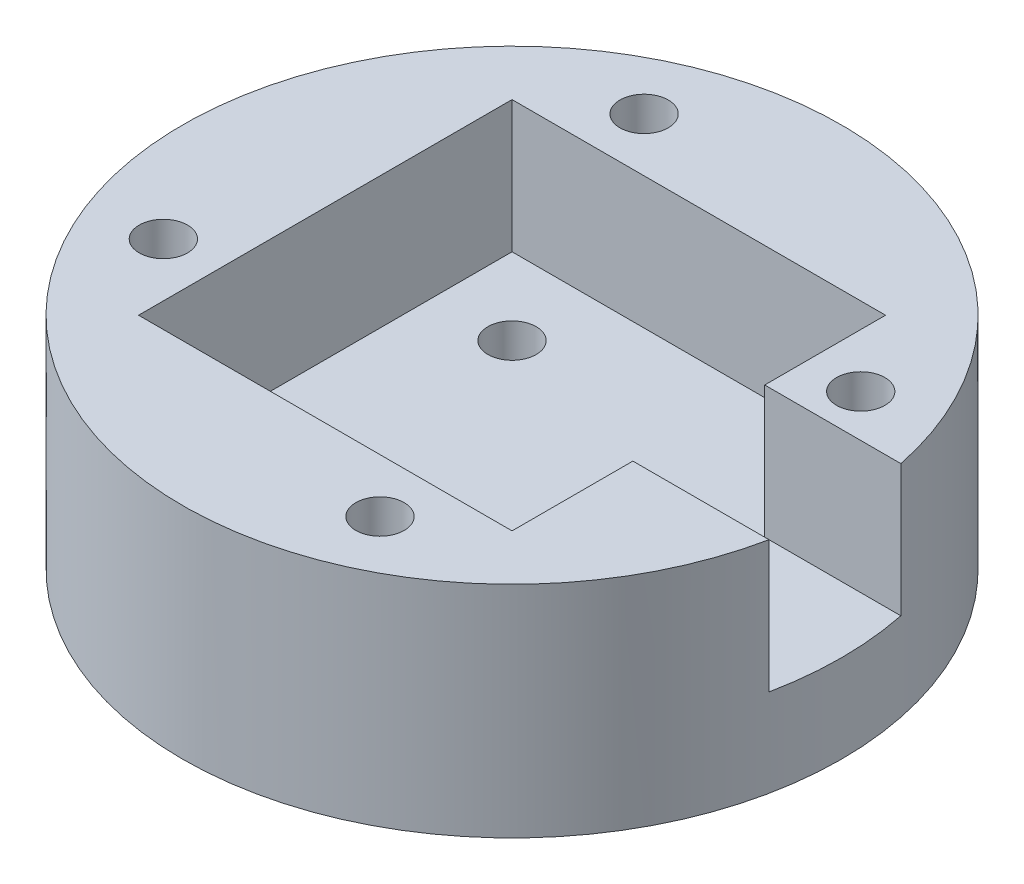
ISO-10303-21;
HEADER;
FILE_DESCRIPTION(('STEP AP214'),'2;1');
FILE_NAME('part.step','',(''),(''),'','','');
FILE_SCHEMA(('AUTOMOTIVE_DESIGN { 1 0 10303 214 1 1 1 1 }'));
ENDSEC;
DATA;
#1=APPLICATION_CONTEXT('core data for automotive mechanical design processes');
#2=APPLICATION_PROTOCOL_DEFINITION('international standard','automotive_design',2000,#1);
#3=PRODUCT_CONTEXT('',#1,'mechanical');
#4=PRODUCT('Part','Part','',(#3));
#5=PRODUCT_RELATED_PRODUCT_CATEGORY('part','',(#4));
#6=PRODUCT_DEFINITION_FORMATION('','',#4);
#7=PRODUCT_DEFINITION_CONTEXT('part definition',#1,'design');
#8=PRODUCT_DEFINITION('design','',#6,#7);
#9=PRODUCT_DEFINITION_SHAPE('','',#8);
#10=(LENGTH_UNIT() NAMED_UNIT(*) SI_UNIT(.MILLI.,.METRE.));
#11=(NAMED_UNIT(*) PLANE_ANGLE_UNIT() SI_UNIT($,.RADIAN.));
#12=(NAMED_UNIT(*) SI_UNIT($,.STERADIAN.) SOLID_ANGLE_UNIT());
#13=UNCERTAINTY_MEASURE_WITH_UNIT(LENGTH_MEASURE(1.E-05),#10,'distance_accuracy_value','');
#14=(GEOMETRIC_REPRESENTATION_CONTEXT(3) GLOBAL_UNCERTAINTY_ASSIGNED_CONTEXT((#13)) GLOBAL_UNIT_ASSIGNED_CONTEXT((#10,
#11,#12)) REPRESENTATION_CONTEXT('',''));
#15=CARTESIAN_POINT('',(0.,0.,0.));
#16=DIRECTION('',(0.,0.,1.));
#17=DIRECTION('',(1.,0.,0.));
#18=AXIS2_PLACEMENT_3D('',#15,#16,#17);
#19=CARTESIAN_POINT('',(0.,10.,0.));
#20=DIRECTION('',(0.,1.,0.));
#21=DIRECTION('',(0.,0.,1.));
#22=AXIS2_PLACEMENT_3D('',#19,#20,#21);
#23=PLANE('',#22);
#24=CARTESIAN_POINT('',(-10.9404889440948,10.,4.93008130400911));
#25=DIRECTION('',(0.,1.,0.));
#26=DIRECTION('',(0.,0.,-1.));
#27=AXIS2_PLACEMENT_3D('',#24,#25,#26);
#28=CIRCLE('',#27,1.1);
#29=CARTESIAN_POINT('',(-10.9404889440948,10.,3.83008130400911));
#30=VERTEX_POINT('',#29);
#31=EDGE_CURVE('E248',#30,#30,#28,.T.);
#32=ORIENTED_EDGE('',*,*,#31,.F.);
#33=EDGE_LOOP('',(#32));
#34=FACE_BOUND('',#33,.T.);
#35=CARTESIAN_POINT('',(-4.930081304009,10.,-10.9404889440948));
#36=DIRECTION('',(0.,1.,0.));
#37=DIRECTION('',(1.,0.,0.));
#38=AXIS2_PLACEMENT_3D('',#35,#36,#37);
#39=CIRCLE('',#38,1.1);
#40=CARTESIAN_POINT('',(-3.830081304009,10.,-10.9404889440948));
#41=VERTEX_POINT('',#40);
#42=EDGE_CURVE('E251',#41,#41,#39,.T.);
#43=ORIENTED_EDGE('',*,*,#42,.F.);
#44=EDGE_LOOP('',(#43));
#45=FACE_BOUND('',#44,.T.);
#46=CARTESIAN_POINT('',(4.93008130400907,10.,10.9404889440948));
#47=DIRECTION('',(0.,1.,0.));
#48=DIRECTION('',(-1.,0.,0.));
#49=AXIS2_PLACEMENT_3D('',#46,#47,#48);
#50=CIRCLE('',#49,1.1);
#51=CARTESIAN_POINT('',(3.83008130400907,10.,10.9404889440948));
#52=VERTEX_POINT('',#51);
#53=EDGE_CURVE('E261',#52,#52,#50,.T.);
#54=ORIENTED_EDGE('',*,*,#53,.F.);
#55=EDGE_LOOP('',(#54));
#56=FACE_BOUND('',#55,.T.);
#57=CARTESIAN_POINT('',(10.9404889440948,10.,-4.93008130400911));
#58=DIRECTION('',(0.,1.,0.));
#59=DIRECTION('',(0.,0.,1.));
#60=AXIS2_PLACEMENT_3D('',#57,#58,#59);
#61=CIRCLE('',#60,1.1);
#62=CARTESIAN_POINT('',(10.9404889440948,10.,-3.83008130400911));
#63=VERTEX_POINT('',#62);
#64=EDGE_CURVE('E267',#63,#63,#61,.T.);
#65=ORIENTED_EDGE('',*,*,#64,.F.);
#66=EDGE_LOOP('',(#65));
#67=FACE_BOUND('',#66,.T.);
#68=DIRECTION('',(-1.,0.,0.));
#69=VECTOR('',#68,1.);
#70=CARTESIAN_POINT('',(0.,10.,3.));
#71=LINE('',#70,#69);
#72=CARTESIAN_POINT('',(14.6969384566991,10.,3.));
#73=VERTEX_POINT('',#72);
#74=CARTESIAN_POINT('',(8.5,10.,3.));
#75=VERTEX_POINT('',#74);
#76=EDGE_CURVE('E95',#73,#75,#71,.T.);
#77=ORIENTED_EDGE('',*,*,#76,.T.);
#78=DIRECTION('',(0.,0.,-1.));
#79=VECTOR('',#78,1.);
#80=CARTESIAN_POINT('',(8.5,10.,0.));
#81=LINE('',#80,#79);
#82=CARTESIAN_POINT('',(8.5,10.,8.5));
#83=VERTEX_POINT('',#82);
#84=EDGE_CURVE('E60',#83,#75,#81,.T.);
#85=ORIENTED_EDGE('',*,*,#84,.F.);
#86=DIRECTION('',(-1.,0.,0.));
#87=VECTOR('',#86,1.);
#88=CARTESIAN_POINT('',(0.,10.,8.5));
#89=LINE('',#88,#87);
#90=CARTESIAN_POINT('',(-8.5,10.,8.5));
#91=VERTEX_POINT('',#90);
#92=EDGE_CURVE('E52',#83,#91,#89,.T.);
#93=ORIENTED_EDGE('',*,*,#92,.T.);
#94=DIRECTION('',(0.,0.,-1.));
#95=VECTOR('',#94,1.);
#96=CARTESIAN_POINT('',(-8.5,10.,0.));
#97=LINE('',#96,#95);
#98=CARTESIAN_POINT('',(-8.5,10.,-8.5));
#99=VERTEX_POINT('',#98);
#100=EDGE_CURVE('E120',#91,#99,#97,.T.);
#101=ORIENTED_EDGE('',*,*,#100,.T.);
#102=DIRECTION('',(-1.,0.,0.));
#103=VECTOR('',#102,1.);
#104=CARTESIAN_POINT('',(0.,10.,-8.5));
#105=LINE('',#104,#103);
#106=CARTESIAN_POINT('',(8.5,10.,-8.5));
#107=VERTEX_POINT('',#106);
#108=EDGE_CURVE('E109',#107,#99,#105,.T.);
#109=ORIENTED_EDGE('',*,*,#108,.F.);
#110=DIRECTION('',(0.,0.,-1.));
#111=VECTOR('',#110,1.);
#112=CARTESIAN_POINT('',(8.5,10.,0.));
#113=LINE('',#112,#111);
#114=CARTESIAN_POINT('',(8.5,10.,-3.));
#115=VERTEX_POINT('',#114);
#116=EDGE_CURVE('E121',#115,#107,#113,.T.);
#117=ORIENTED_EDGE('',*,*,#116,.F.);
#118=DIRECTION('',(-1.,0.,0.));
#119=VECTOR('',#118,1.);
#120=CARTESIAN_POINT('',(0.,10.,-3.));
#121=LINE('',#120,#119);
#122=CARTESIAN_POINT('',(14.6969384566991,10.,-3.));
#123=VERTEX_POINT('',#122);
#124=EDGE_CURVE('E290',#123,#115,#121,.T.);
#125=ORIENTED_EDGE('',*,*,#124,.F.);
#126=CARTESIAN_POINT('',(0.,10.,0.));
#127=DIRECTION('',(0.,1.,0.));
#128=DIRECTION('',(0.,0.,1.));
#129=AXIS2_PLACEMENT_3D('',#126,#127,#128);
#130=CIRCLE('',#129,15.);
#131=EDGE_CURVE('E11',#123,#73,#130,.T.);
#132=ORIENTED_EDGE('',*,*,#131,.T.);
#133=EDGE_LOOP('',(#77,#85,#93,#101,#109,#117,#125,#132));
#134=FACE_BOUND('',#133,.T.);
#135=ADVANCED_FACE('F37',(#34,#45,#56,#67,#134),#23,.T.);
#136=CARTESIAN_POINT('',(0.,10.,0.));
#137=DIRECTION('',(0.,-1.,0.));
#138=DIRECTION('',(0.,0.,-1.));
#139=AXIS2_PLACEMENT_3D('',#136,#137,#138);
#140=CYLINDRICAL_SURFACE('',#139,15.);
#141=CARTESIAN_POINT('',(0.,4.,0.));
#142=DIRECTION('',(0.,1.,0.));
#143=DIRECTION('',(0.,0.,1.));
#144=AXIS2_PLACEMENT_3D('',#141,#142,#143);
#145=CIRCLE('',#144,15.);
#146=CARTESIAN_POINT('',(14.6969384566991,4.,3.));
#147=VERTEX_POINT('',#146);
#148=CARTESIAN_POINT('',(14.6969384566991,4.,-3.));
#149=VERTEX_POINT('',#148);
#150=EDGE_CURVE('E139',#147,#149,#145,.T.);
#151=ORIENTED_EDGE('',*,*,#150,.F.);
#152=DIRECTION('',(0.,-1.,0.));
#153=VECTOR('',#152,1.);
#154=CARTESIAN_POINT('',(14.6969384566991,10.,3.));
#155=LINE('',#154,#153);
#156=EDGE_CURVE('E165',#73,#147,#155,.T.);
#157=ORIENTED_EDGE('',*,*,#156,.F.);
#158=ORIENTED_EDGE('',*,*,#131,.F.);
#159=DIRECTION('',(0.,-1.,0.));
#160=VECTOR('',#159,1.);
#161=CARTESIAN_POINT('',(14.6969384566991,10.,-3.));
#162=LINE('',#161,#160);
#163=EDGE_CURVE('E162',#123,#149,#162,.T.);
#164=ORIENTED_EDGE('',*,*,#163,.T.);
#165=EDGE_LOOP('',(#151,#157,#158,#164));
#166=FACE_BOUND('',#165,.T.);
#167=CARTESIAN_POINT('',(0.,0.,0.));
#168=DIRECTION('',(0.,1.,0.));
#169=DIRECTION('',(0.,0.,1.));
#170=AXIS2_PLACEMENT_3D('',#167,#168,#169);
#171=CIRCLE('',#170,15.);
#172=CARTESIAN_POINT('',(0.,0.,15.));
#173=VERTEX_POINT('',#172);
#174=EDGE_CURVE('E41',#173,#173,#171,.T.);
#175=ORIENTED_EDGE('',*,*,#174,.T.);
#176=EDGE_LOOP('',(#175));
#177=FACE_BOUND('',#176,.T.);
#178=ADVANCED_FACE('F39',(#166,#177),#140,.T.);
#179=CARTESIAN_POINT('',(0.,0.,0.));
#180=DIRECTION('',(0.,1.,0.));
#181=DIRECTION('',(0.,0.,1.));
#182=AXIS2_PLACEMENT_3D('',#179,#180,#181);
#183=PLANE('',#182);
#184=CARTESIAN_POINT('',(-10.9404889440948,0.,4.93008130400911));
#185=DIRECTION('',(0.,1.,0.));
#186=DIRECTION('',(0.,0.,-1.));
#187=AXIS2_PLACEMENT_3D('',#184,#185,#186);
#188=CIRCLE('',#187,1.1);
#189=CARTESIAN_POINT('',(-10.9404889440948,0.,3.83008130400911));
#190=VERTEX_POINT('',#189);
#191=EDGE_CURVE('E250',#190,#190,#188,.T.);
#192=ORIENTED_EDGE('',*,*,#191,.T.);
#193=EDGE_LOOP('',(#192));
#194=FACE_BOUND('',#193,.T.);
#195=CARTESIAN_POINT('',(-4.930081304009,0.,-10.9404889440948));
#196=DIRECTION('',(0.,1.,0.));
#197=DIRECTION('',(1.,0.,0.));
#198=AXIS2_PLACEMENT_3D('',#195,#196,#197);
#199=CIRCLE('',#198,1.1);
#200=CARTESIAN_POINT('',(-3.830081304009,0.,-10.9404889440948));
#201=VERTEX_POINT('',#200);
#202=EDGE_CURVE('E256',#201,#201,#199,.T.);
#203=ORIENTED_EDGE('',*,*,#202,.T.);
#204=EDGE_LOOP('',(#203));
#205=FACE_BOUND('',#204,.T.);
#206=CARTESIAN_POINT('',(4.93008130400907,0.,10.9404889440948));
#207=DIRECTION('',(0.,1.,0.));
#208=DIRECTION('',(-1.,0.,0.));
#209=AXIS2_PLACEMENT_3D('',#206,#207,#208);
#210=CIRCLE('',#209,1.1);
#211=CARTESIAN_POINT('',(3.83008130400907,0.,10.9404889440948));
#212=VERTEX_POINT('',#211);
#213=EDGE_CURVE('E253',#212,#212,#210,.T.);
#214=ORIENTED_EDGE('',*,*,#213,.T.);
#215=EDGE_LOOP('',(#214));
#216=FACE_BOUND('',#215,.T.);
#217=CARTESIAN_POINT('',(10.9404889440948,0.,-4.93008130400911));
#218=DIRECTION('',(0.,1.,0.));
#219=DIRECTION('',(0.,0.,1.));
#220=AXIS2_PLACEMENT_3D('',#217,#218,#219);
#221=CIRCLE('',#220,1.1);
#222=CARTESIAN_POINT('',(10.9404889440948,0.,-3.83008130400911));
#223=VERTEX_POINT('',#222);
#224=EDGE_CURVE('E264',#223,#223,#221,.T.);
#225=ORIENTED_EDGE('',*,*,#224,.T.);
#226=EDGE_LOOP('',(#225));
#227=FACE_BOUND('',#226,.T.);
#228=CARTESIAN_POINT('',(0.,0.,0.));
#229=DIRECTION('',(0.,1.,0.));
#230=DIRECTION('',(0.,0.,1.));
#231=AXIS2_PLACEMENT_3D('',#228,#229,#230);
#232=CIRCLE('',#231,5.);
#233=CARTESIAN_POINT('',(0.,0.,5.));
#234=VERTEX_POINT('',#233);
#235=EDGE_CURVE('E270',#234,#234,#232,.T.);
#236=ORIENTED_EDGE('',*,*,#235,.T.);
#237=EDGE_LOOP('',(#236));
#238=FACE_BOUND('',#237,.T.);
#239=CARTESIAN_POINT('',(-5.,0.,5.));
#240=DIRECTION('',(0.,1.,0.));
#241=DIRECTION('',(0.,0.,1.));
#242=AXIS2_PLACEMENT_3D('',#239,#240,#241);
#243=CIRCLE('',#242,1.1);
#244=CARTESIAN_POINT('',(-5.,0.,6.1));
#245=VERTEX_POINT('',#244);
#246=EDGE_CURVE('E276',#245,#245,#243,.T.);
#247=ORIENTED_EDGE('',*,*,#246,.T.);
#248=EDGE_LOOP('',(#247));
#249=FACE_BOUND('',#248,.T.);
#250=CARTESIAN_POINT('',(-5.,0.,-5.));
#251=DIRECTION('',(0.,1.,0.));
#252=DIRECTION('',(0.,0.,1.));
#253=AXIS2_PLACEMENT_3D('',#250,#251,#252);
#254=CIRCLE('',#253,1.1);
#255=CARTESIAN_POINT('',(-5.,0.,-3.9));
#256=VERTEX_POINT('',#255);
#257=EDGE_CURVE('E284',#256,#256,#254,.T.);
#258=ORIENTED_EDGE('',*,*,#257,.T.);
#259=EDGE_LOOP('',(#258));
#260=FACE_BOUND('',#259,.T.);
#261=ORIENTED_EDGE('',*,*,#174,.F.);
#262=EDGE_LOOP('',(#261));
#263=FACE_BOUND('',#262,.T.);
#264=ADVANCED_FACE('F171',(#194,#205,#216,#227,#238,#249,#260,#263),#183,.F.);
#265=CARTESIAN_POINT('',(0.,10.,3.));
#266=DIRECTION('',(0.,0.,1.));
#267=DIRECTION('',(1.,0.,0.));
#268=AXIS2_PLACEMENT_3D('',#265,#266,#267);
#269=PLANE('',#268);
#270=DIRECTION('',(-1.,0.,0.));
#271=VECTOR('',#270,1.);
#272=CARTESIAN_POINT('',(0.,4.,3.));
#273=LINE('',#272,#271);
#274=CARTESIAN_POINT('',(8.5,4.,3.));
#275=VERTEX_POINT('',#274);
#276=EDGE_CURVE('E136',#147,#275,#273,.T.);
#277=ORIENTED_EDGE('',*,*,#276,.T.);
#278=DIRECTION('',(0.,-1.,0.));
#279=VECTOR('',#278,1.);
#280=CARTESIAN_POINT('',(8.5,10.,3.));
#281=LINE('',#280,#279);
#282=EDGE_CURVE('E88',#75,#275,#281,.T.);
#283=ORIENTED_EDGE('',*,*,#282,.F.);
#284=ORIENTED_EDGE('',*,*,#76,.F.);
#285=ORIENTED_EDGE('',*,*,#156,.T.);
#286=EDGE_LOOP('',(#277,#283,#284,#285));
#287=FACE_BOUND('',#286,.T.);
#288=ADVANCED_FACE('F173',(#287),#269,.F.);
#289=CARTESIAN_POINT('',(0.,10.,-3.));
#290=DIRECTION('',(0.,0.,1.));
#291=DIRECTION('',(1.,0.,0.));
#292=AXIS2_PLACEMENT_3D('',#289,#290,#291);
#293=PLANE('',#292);
#294=DIRECTION('',(-1.,0.,0.));
#295=VECTOR('',#294,1.);
#296=CARTESIAN_POINT('',(0.,4.,-3.));
#297=LINE('',#296,#295);
#298=CARTESIAN_POINT('',(8.5,4.,-3.));
#299=VERTEX_POINT('',#298);
#300=EDGE_CURVE('E142',#149,#299,#297,.T.);
#301=ORIENTED_EDGE('',*,*,#300,.F.);
#302=ORIENTED_EDGE('',*,*,#163,.F.);
#303=ORIENTED_EDGE('',*,*,#124,.T.);
#304=DIRECTION('',(0.,-1.,0.));
#305=VECTOR('',#304,1.);
#306=CARTESIAN_POINT('',(8.5,10.,-3.));
#307=LINE('',#306,#305);
#308=EDGE_CURVE('E159',#115,#299,#307,.T.);
#309=ORIENTED_EDGE('',*,*,#308,.T.);
#310=EDGE_LOOP('',(#301,#302,#303,#309));
#311=FACE_BOUND('',#310,.T.);
#312=ADVANCED_FACE('F179',(#311),#293,.T.);
#313=CARTESIAN_POINT('',(8.5,10.,0.));
#314=DIRECTION('',(-1.,0.,0.));
#315=DIRECTION('',(0.,0.,1.));
#316=AXIS2_PLACEMENT_3D('',#313,#314,#315);
#317=PLANE('',#316);
#318=DIRECTION('',(0.,0.,-1.));
#319=VECTOR('',#318,1.);
#320=CARTESIAN_POINT('',(8.5,4.,0.));
#321=LINE('',#320,#319);
#322=CARTESIAN_POINT('',(8.5,4.,-8.5));
#323=VERTEX_POINT('',#322);
#324=EDGE_CURVE('E144',#299,#323,#321,.T.);
#325=ORIENTED_EDGE('',*,*,#324,.F.);
#326=ORIENTED_EDGE('',*,*,#308,.F.);
#327=ORIENTED_EDGE('',*,*,#116,.T.);
#328=DIRECTION('',(0.,-1.,0.));
#329=VECTOR('',#328,1.);
#330=CARTESIAN_POINT('',(8.5,10.,-8.5));
#331=LINE('',#330,#329);
#332=EDGE_CURVE('E116',#107,#323,#331,.T.);
#333=ORIENTED_EDGE('',*,*,#332,.T.);
#334=EDGE_LOOP('',(#325,#326,#327,#333));
#335=FACE_BOUND('',#334,.T.);
#336=ADVANCED_FACE('F194',(#335),#317,.T.);
#337=CARTESIAN_POINT('',(0.,10.,-8.5));
#338=DIRECTION('',(0.,0.,1.));
#339=DIRECTION('',(1.,0.,0.));
#340=AXIS2_PLACEMENT_3D('',#337,#338,#339);
#341=PLANE('',#340);
#342=DIRECTION('',(-1.,0.,0.));
#343=VECTOR('',#342,1.);
#344=CARTESIAN_POINT('',(0.,4.,-8.5));
#345=LINE('',#344,#343);
#346=CARTESIAN_POINT('',(-8.5,4.,-8.5));
#347=VERTEX_POINT('',#346);
#348=EDGE_CURVE('E146',#323,#347,#345,.T.);
#349=ORIENTED_EDGE('',*,*,#348,.F.);
#350=ORIENTED_EDGE('',*,*,#332,.F.);
#351=ORIENTED_EDGE('',*,*,#108,.T.);
#352=DIRECTION('',(0.,-1.,0.));
#353=VECTOR('',#352,1.);
#354=CARTESIAN_POINT('',(-8.5,10.,-8.5));
#355=LINE('',#354,#353);
#356=EDGE_CURVE('E113',#99,#347,#355,.T.);
#357=ORIENTED_EDGE('',*,*,#356,.T.);
#358=EDGE_LOOP('',(#349,#350,#351,#357));
#359=FACE_BOUND('',#358,.T.);
#360=ADVANCED_FACE('F112',(#359),#341,.T.);
#361=CARTESIAN_POINT('',(-8.5,10.,0.));
#362=DIRECTION('',(-1.,0.,0.));
#363=DIRECTION('',(0.,0.,1.));
#364=AXIS2_PLACEMENT_3D('',#361,#362,#363);
#365=PLANE('',#364);
#366=DIRECTION('',(0.,0.,-1.));
#367=VECTOR('',#366,1.);
#368=CARTESIAN_POINT('',(-8.5,4.,0.));
#369=LINE('',#368,#367);
#370=CARTESIAN_POINT('',(-8.5,4.,8.5));
#371=VERTEX_POINT('',#370);
#372=EDGE_CURVE('E128',#371,#347,#369,.T.);
#373=ORIENTED_EDGE('',*,*,#372,.T.);
#374=ORIENTED_EDGE('',*,*,#356,.F.);
#375=ORIENTED_EDGE('',*,*,#100,.F.);
#376=DIRECTION('',(0.,-1.,0.));
#377=VECTOR('',#376,1.);
#378=CARTESIAN_POINT('',(-8.5,10.,8.5));
#379=LINE('',#378,#377);
#380=EDGE_CURVE('E129',#91,#371,#379,.T.);
#381=ORIENTED_EDGE('',*,*,#380,.T.);
#382=EDGE_LOOP('',(#373,#374,#375,#381));
#383=FACE_BOUND('',#382,.T.);
#384=ADVANCED_FACE('F126',(#383),#365,.F.);
#385=CARTESIAN_POINT('',(0.,10.,8.5));
#386=DIRECTION('',(0.,0.,1.));
#387=DIRECTION('',(1.,0.,0.));
#388=AXIS2_PLACEMENT_3D('',#385,#386,#387);
#389=PLANE('',#388);
#390=DIRECTION('',(-1.,0.,0.));
#391=VECTOR('',#390,1.);
#392=CARTESIAN_POINT('',(0.,4.,8.5));
#393=LINE('',#392,#391);
#394=CARTESIAN_POINT('',(8.5,4.,8.5));
#395=VERTEX_POINT('',#394);
#396=EDGE_CURVE('E149',#395,#371,#393,.T.);
#397=ORIENTED_EDGE('',*,*,#396,.T.);
#398=ORIENTED_EDGE('',*,*,#380,.F.);
#399=ORIENTED_EDGE('',*,*,#92,.F.);
#400=DIRECTION('',(0.,-1.,0.));
#401=VECTOR('',#400,1.);
#402=CARTESIAN_POINT('',(8.5,10.,8.5));
#403=LINE('',#402,#401);
#404=EDGE_CURVE('E155',#83,#395,#403,.T.);
#405=ORIENTED_EDGE('',*,*,#404,.T.);
#406=EDGE_LOOP('',(#397,#398,#399,#405));
#407=FACE_BOUND('',#406,.T.);
#408=ADVANCED_FACE('F203',(#407),#389,.F.);
#409=CARTESIAN_POINT('',(8.5,10.,0.));
#410=DIRECTION('',(-1.,0.,0.));
#411=DIRECTION('',(0.,0.,1.));
#412=AXIS2_PLACEMENT_3D('',#409,#410,#411);
#413=PLANE('',#412);
#414=DIRECTION('',(0.,0.,-1.));
#415=VECTOR('',#414,1.);
#416=CARTESIAN_POINT('',(8.5,4.,0.));
#417=LINE('',#416,#415);
#418=EDGE_CURVE('E152',#395,#275,#417,.T.);
#419=ORIENTED_EDGE('',*,*,#418,.F.);
#420=ORIENTED_EDGE('',*,*,#404,.F.);
#421=ORIENTED_EDGE('',*,*,#84,.T.);
#422=ORIENTED_EDGE('',*,*,#282,.T.);
#423=EDGE_LOOP('',(#419,#420,#421,#422));
#424=FACE_BOUND('',#423,.T.);
#425=ADVANCED_FACE('F206',(#424),#413,.T.);
#426=CARTESIAN_POINT('',(0.,4.,0.));
#427=DIRECTION('',(0.,1.,0.));
#428=DIRECTION('',(0.,0.,1.));
#429=AXIS2_PLACEMENT_3D('',#426,#427,#428);
#430=PLANE('',#429);
#431=ORIENTED_EDGE('',*,*,#276,.F.);
#432=ORIENTED_EDGE('',*,*,#150,.T.);
#433=ORIENTED_EDGE('',*,*,#300,.T.);
#434=ORIENTED_EDGE('',*,*,#324,.T.);
#435=ORIENTED_EDGE('',*,*,#348,.T.);
#436=ORIENTED_EDGE('',*,*,#372,.F.);
#437=ORIENTED_EDGE('',*,*,#396,.F.);
#438=ORIENTED_EDGE('',*,*,#418,.T.);
#439=EDGE_LOOP('',(#431,#432,#433,#434,#435,#436,#437,#438));
#440=FACE_BOUND('',#439,.T.);
#441=CARTESIAN_POINT('',(-5.,4.,5.));
#442=DIRECTION('',(0.,1.,0.));
#443=DIRECTION('',(0.,0.,1.));
#444=AXIS2_PLACEMENT_3D('',#441,#442,#443);
#445=CIRCLE('',#444,1.1);
#446=CARTESIAN_POINT('',(-5.,4.,6.1));
#447=VERTEX_POINT('',#446);
#448=EDGE_CURVE('E281',#447,#447,#445,.F.);
#449=ORIENTED_EDGE('',*,*,#448,.T.);
#450=EDGE_LOOP('',(#449));
#451=FACE_BOUND('',#450,.T.);
#452=CARTESIAN_POINT('',(-5.,4.,-5.));
#453=DIRECTION('',(0.,1.,0.));
#454=DIRECTION('',(0.,0.,1.));
#455=AXIS2_PLACEMENT_3D('',#452,#453,#454);
#456=CIRCLE('',#455,1.1);
#457=CARTESIAN_POINT('',(-5.,4.,-3.9));
#458=VERTEX_POINT('',#457);
#459=EDGE_CURVE('E140',#458,#458,#456,.F.);
#460=ORIENTED_EDGE('',*,*,#459,.T.);
#461=EDGE_LOOP('',(#460));
#462=FACE_BOUND('',#461,.T.);
#463=ADVANCED_FACE('F209',(#440,#451,#462),#430,.T.);
#464=CARTESIAN_POINT('',(-5.,10.,-5.));
#465=DIRECTION('',(0.,-1.,0.));
#466=DIRECTION('',(0.,0.,-1.));
#467=AXIS2_PLACEMENT_3D('',#464,#465,#466);
#468=CYLINDRICAL_SURFACE('',#467,1.1);
#469=ORIENTED_EDGE('',*,*,#459,.F.);
#470=EDGE_LOOP('',(#469));
#471=FACE_BOUND('',#470,.T.);
#472=ORIENTED_EDGE('',*,*,#257,.F.);
#473=EDGE_LOOP('',(#472));
#474=FACE_BOUND('',#473,.T.);
#475=ADVANCED_FACE('F212',(#471,#474),#468,.F.);
#476=CARTESIAN_POINT('',(-5.,10.,5.));
#477=DIRECTION('',(0.,-1.,0.));
#478=DIRECTION('',(0.,0.,-1.));
#479=AXIS2_PLACEMENT_3D('',#476,#477,#478);
#480=CYLINDRICAL_SURFACE('',#479,1.1);
#481=ORIENTED_EDGE('',*,*,#448,.F.);
#482=EDGE_LOOP('',(#481));
#483=FACE_BOUND('',#482,.T.);
#484=ORIENTED_EDGE('',*,*,#246,.F.);
#485=EDGE_LOOP('',(#484));
#486=FACE_BOUND('',#485,.T.);
#487=ADVANCED_FACE('F216',(#483,#486),#480,.F.);
#488=CARTESIAN_POINT('',(0.,3.,0.));
#489=DIRECTION('',(0.,-1.,0.));
#490=DIRECTION('',(0.,0.,-1.));
#491=AXIS2_PLACEMENT_3D('',#488,#489,#490);
#492=CYLINDRICAL_SURFACE('',#491,5.);
#493=CARTESIAN_POINT('',(0.,3.,0.));
#494=DIRECTION('',(0.,1.,0.));
#495=DIRECTION('',(0.,0.,1.));
#496=AXIS2_PLACEMENT_3D('',#493,#494,#495);
#497=CIRCLE('',#496,5.);
#498=CARTESIAN_POINT('',(0.,3.,5.));
#499=VERTEX_POINT('',#498);
#500=EDGE_CURVE('E273',#499,#499,#497,.T.);
#501=ORIENTED_EDGE('',*,*,#500,.T.);
#502=EDGE_LOOP('',(#501));
#503=FACE_BOUND('',#502,.T.);
#504=ORIENTED_EDGE('',*,*,#235,.F.);
#505=EDGE_LOOP('',(#504));
#506=FACE_BOUND('',#505,.T.);
#507=ADVANCED_FACE('F220',(#503,#506),#492,.F.);
#508=CARTESIAN_POINT('',(0.,3.,0.));
#509=DIRECTION('',(0.,1.,0.));
#510=DIRECTION('',(0.,0.,1.));
#511=AXIS2_PLACEMENT_3D('',#508,#509,#510);
#512=PLANE('',#511);
#513=ORIENTED_EDGE('',*,*,#500,.F.);
#514=EDGE_LOOP('',(#513));
#515=FACE_BOUND('',#514,.T.);
#516=ADVANCED_FACE('F224',(#515),#512,.F.);
#517=CARTESIAN_POINT('',(10.9404889440948,10.,-4.93008130400911));
#518=DIRECTION('',(0.,-1.,0.));
#519=DIRECTION('',(0.,0.,-1.));
#520=AXIS2_PLACEMENT_3D('',#517,#518,#519);
#521=CYLINDRICAL_SURFACE('',#520,1.1);
#522=ORIENTED_EDGE('',*,*,#64,.T.);
#523=EDGE_LOOP('',(#522));
#524=FACE_BOUND('',#523,.T.);
#525=ORIENTED_EDGE('',*,*,#224,.F.);
#526=EDGE_LOOP('',(#525));
#527=FACE_BOUND('',#526,.T.);
#528=ADVANCED_FACE('F228',(#524,#527),#521,.F.);
#529=CARTESIAN_POINT('',(4.93008130400907,10.,10.9404889440948));
#530=DIRECTION('',(0.,-1.,0.));
#531=DIRECTION('',(0.,0.,-1.));
#532=AXIS2_PLACEMENT_3D('',#529,#530,#531);
#533=CYLINDRICAL_SURFACE('',#532,1.1);
#534=ORIENTED_EDGE('',*,*,#53,.T.);
#535=EDGE_LOOP('',(#534));
#536=FACE_BOUND('',#535,.T.);
#537=ORIENTED_EDGE('',*,*,#213,.F.);
#538=EDGE_LOOP('',(#537));
#539=FACE_BOUND('',#538,.T.);
#540=ADVANCED_FACE('F232',(#536,#539),#533,.F.);
#541=CARTESIAN_POINT('',(-4.930081304009,10.,-10.9404889440948));
#542=DIRECTION('',(0.,-1.,0.));
#543=DIRECTION('',(0.,0.,-1.));
#544=AXIS2_PLACEMENT_3D('',#541,#542,#543);
#545=CYLINDRICAL_SURFACE('',#544,1.1);
#546=ORIENTED_EDGE('',*,*,#42,.T.);
#547=EDGE_LOOP('',(#546));
#548=FACE_BOUND('',#547,.T.);
#549=ORIENTED_EDGE('',*,*,#202,.F.);
#550=EDGE_LOOP('',(#549));
#551=FACE_BOUND('',#550,.T.);
#552=ADVANCED_FACE('F236',(#548,#551),#545,.F.);
#553=CARTESIAN_POINT('',(-10.9404889440948,10.,4.93008130400911));
#554=DIRECTION('',(0.,-1.,0.));
#555=DIRECTION('',(0.,0.,-1.));
#556=AXIS2_PLACEMENT_3D('',#553,#554,#555);
#557=CYLINDRICAL_SURFACE('',#556,1.1);
#558=ORIENTED_EDGE('',*,*,#31,.T.);
#559=EDGE_LOOP('',(#558));
#560=FACE_BOUND('',#559,.T.);
#561=ORIENTED_EDGE('',*,*,#191,.F.);
#562=EDGE_LOOP('',(#561));
#563=FACE_BOUND('',#562,.T.);
#564=ADVANCED_FACE('F240',(#560,#563),#557,.F.);
#565=CLOSED_SHELL('',(#135,#178,#264,#288,#312,#336,#360,#384,#408,#425,#463,#475,#487,#507,
#516,#528,#540,#552,#564));
#566=MANIFOLD_SOLID_BREP('B2',#565);
#567=ADVANCED_BREP_SHAPE_REPRESENTATION('',(#18,#566),#14);
#568=SHAPE_DEFINITION_REPRESENTATION(#9,#567);
ENDSEC;
END-ISO-10303-21;
